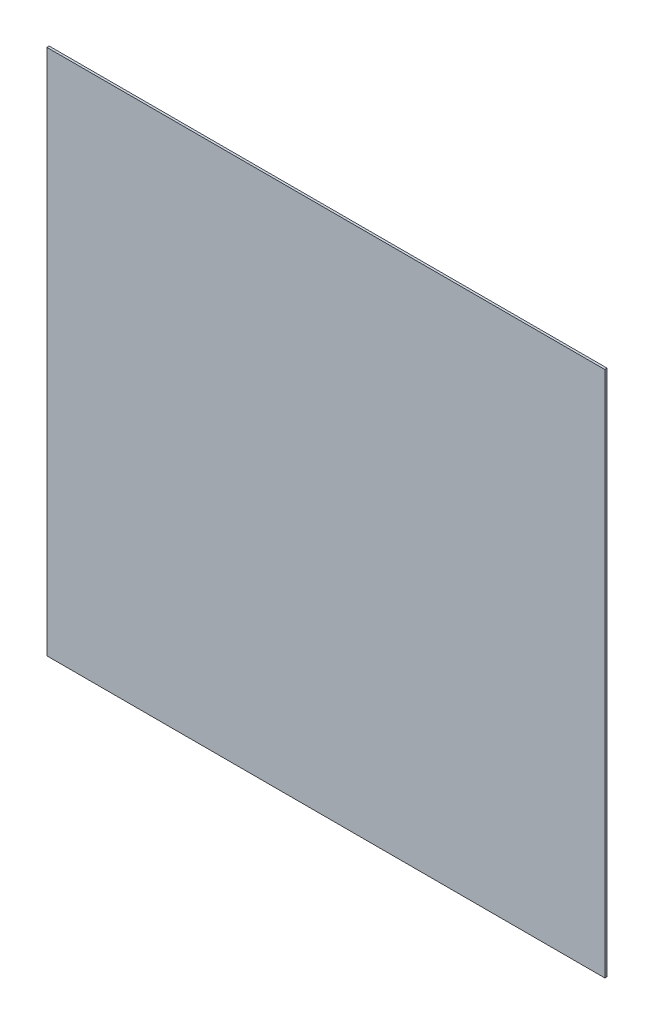
ISO-10303-21;
HEADER;
FILE_DESCRIPTION(('STEP AP214'),'2;1');
FILE_NAME('part.step','',(''),(''),'','','');
FILE_SCHEMA(('AUTOMOTIVE_DESIGN { 1 0 10303 214 1 1 1 1 }'));
ENDSEC;
DATA;
#1=APPLICATION_CONTEXT('core data for automotive mechanical design processes');
#2=APPLICATION_PROTOCOL_DEFINITION('international standard','automotive_design',2000,#1);
#3=PRODUCT_CONTEXT('',#1,'mechanical');
#4=PRODUCT('Part','Part','',(#3));
#5=PRODUCT_RELATED_PRODUCT_CATEGORY('part','',(#4));
#6=PRODUCT_DEFINITION_FORMATION('','',#4);
#7=PRODUCT_DEFINITION_CONTEXT('part definition',#1,'design');
#8=PRODUCT_DEFINITION('design','',#6,#7);
#9=PRODUCT_DEFINITION_SHAPE('','',#8);
#10=(LENGTH_UNIT() NAMED_UNIT(*) SI_UNIT(.MILLI.,.METRE.));
#11=(NAMED_UNIT(*) PLANE_ANGLE_UNIT() SI_UNIT($,.RADIAN.));
#12=(NAMED_UNIT(*) SI_UNIT($,.STERADIAN.) SOLID_ANGLE_UNIT());
#13=UNCERTAINTY_MEASURE_WITH_UNIT(LENGTH_MEASURE(1.E-05),#10,'distance_accuracy_value','');
#14=(GEOMETRIC_REPRESENTATION_CONTEXT(3) GLOBAL_UNCERTAINTY_ASSIGNED_CONTEXT((#13)) GLOBAL_UNIT_ASSIGNED_CONTEXT((#10,
#11,#12)) REPRESENTATION_CONTEXT('',''));
#15=CARTESIAN_POINT('',(0.,0.,0.));
#16=DIRECTION('',(0.,0.,1.));
#17=DIRECTION('',(1.,0.,0.));
#18=AXIS2_PLACEMENT_3D('',#15,#16,#17);
#19=CARTESIAN_POINT('',(0.,0.,0.75));
#20=DIRECTION('',(1.,0.,0.));
#21=DIRECTION('',(0.,0.,-1.));
#22=AXIS2_PLACEMENT_3D('',#19,#20,#21);
#23=PLANE('',#22);
#24=DIRECTION('',(0.,-1.,0.));
#25=VECTOR('',#24,1.);
#26=CARTESIAN_POINT('',(0.,0.,0.));
#27=LINE('',#26,#25);
#28=CARTESIAN_POINT('',(0.,170.,0.));
#29=VERTEX_POINT('',#28);
#30=CARTESIAN_POINT('',(0.,0.,0.));
#31=VERTEX_POINT('',#30);
#32=EDGE_CURVE('E98',#29,#31,#27,.T.);
#33=ORIENTED_EDGE('',*,*,#32,.T.);
#34=DIRECTION('',(0.,0.,-1.));
#35=VECTOR('',#34,1.);
#36=CARTESIAN_POINT('',(0.,0.,0.75));
#37=LINE('',#36,#35);
#38=CARTESIAN_POINT('',(0.,0.,0.75));
#39=VERTEX_POINT('',#38);
#40=EDGE_CURVE('E11',#39,#31,#37,.T.);
#41=ORIENTED_EDGE('',*,*,#40,.F.);
#42=DIRECTION('',(0.,-1.,0.));
#43=VECTOR('',#42,1.);
#44=CARTESIAN_POINT('',(0.,0.,0.75));
#45=LINE('',#44,#43);
#46=CARTESIAN_POINT('',(0.,170.,0.75));
#47=VERTEX_POINT('',#46);
#48=EDGE_CURVE('E86',#47,#39,#45,.T.);
#49=ORIENTED_EDGE('',*,*,#48,.F.);
#50=DIRECTION('',(0.,0.,-1.));
#51=VECTOR('',#50,1.);
#52=CARTESIAN_POINT('',(0.,170.,0.75));
#53=LINE('',#52,#51);
#54=EDGE_CURVE('E94',#47,#29,#53,.T.);
#55=ORIENTED_EDGE('',*,*,#54,.T.);
#56=EDGE_LOOP('',(#33,#41,#49,#55));
#57=FACE_BOUND('',#56,.T.);
#58=ADVANCED_FACE('F35',(#57),#23,.F.);
#59=CARTESIAN_POINT('',(0.,0.,0.75));
#60=DIRECTION('',(0.,1.,0.));
#61=DIRECTION('',(0.,0.,1.));
#62=AXIS2_PLACEMENT_3D('',#59,#60,#61);
#63=PLANE('',#62);
#64=DIRECTION('',(1.,0.,0.));
#65=VECTOR('',#64,1.);
#66=CARTESIAN_POINT('',(0.,0.,0.));
#67=LINE('',#66,#65);
#68=CARTESIAN_POINT('',(180.,0.,0.));
#69=VERTEX_POINT('',#68);
#70=EDGE_CURVE('E90',#31,#69,#67,.T.);
#71=ORIENTED_EDGE('',*,*,#70,.T.);
#72=DIRECTION('',(0.,0.,-1.));
#73=VECTOR('',#72,1.);
#74=CARTESIAN_POINT('',(180.,0.,0.75));
#75=LINE('',#74,#73);
#76=CARTESIAN_POINT('',(180.,0.,0.75));
#77=VERTEX_POINT('',#76);
#78=EDGE_CURVE('E43',#77,#69,#75,.T.);
#79=ORIENTED_EDGE('',*,*,#78,.F.);
#80=DIRECTION('',(1.,0.,0.));
#81=VECTOR('',#80,1.);
#82=CARTESIAN_POINT('',(0.,0.,0.75));
#83=LINE('',#82,#81);
#84=EDGE_CURVE('E81',#39,#77,#83,.T.);
#85=ORIENTED_EDGE('',*,*,#84,.F.);
#86=ORIENTED_EDGE('',*,*,#40,.T.);
#87=EDGE_LOOP('',(#71,#79,#85,#86));
#88=FACE_BOUND('',#87,.T.);
#89=ADVANCED_FACE('F89',(#88),#63,.F.);
#90=CARTESIAN_POINT('',(180.,0.,0.75));
#91=DIRECTION('',(-1.,0.,0.));
#92=DIRECTION('',(0.,0.,1.));
#93=AXIS2_PLACEMENT_3D('',#90,#91,#92);
#94=PLANE('',#93);
#95=DIRECTION('',(0.,1.,0.));
#96=VECTOR('',#95,1.);
#97=CARTESIAN_POINT('',(180.,0.,0.));
#98=LINE('',#97,#96);
#99=CARTESIAN_POINT('',(180.,170.,0.));
#100=VERTEX_POINT('',#99);
#101=EDGE_CURVE('E68',#69,#100,#98,.T.);
#102=ORIENTED_EDGE('',*,*,#101,.T.);
#103=DIRECTION('',(0.,0.,-1.));
#104=VECTOR('',#103,1.);
#105=CARTESIAN_POINT('',(180.,170.,0.75));
#106=LINE('',#105,#104);
#107=CARTESIAN_POINT('',(180.,170.,0.75));
#108=VERTEX_POINT('',#107);
#109=EDGE_CURVE('E91',#108,#100,#106,.T.);
#110=ORIENTED_EDGE('',*,*,#109,.F.);
#111=DIRECTION('',(0.,1.,0.));
#112=VECTOR('',#111,1.);
#113=CARTESIAN_POINT('',(180.,0.,0.75));
#114=LINE('',#113,#112);
#115=EDGE_CURVE('E84',#77,#108,#114,.T.);
#116=ORIENTED_EDGE('',*,*,#115,.F.);
#117=ORIENTED_EDGE('',*,*,#78,.T.);
#118=EDGE_LOOP('',(#102,#110,#116,#117));
#119=FACE_BOUND('',#118,.T.);
#120=ADVANCED_FACE('F92',(#119),#94,.F.);
#121=CARTESIAN_POINT('',(0.,170.,0.75));
#122=DIRECTION('',(0.,-1.,0.));
#123=DIRECTION('',(0.,0.,-1.));
#124=AXIS2_PLACEMENT_3D('',#121,#122,#123);
#125=PLANE('',#124);
#126=DIRECTION('',(-1.,0.,0.));
#127=VECTOR('',#126,1.);
#128=CARTESIAN_POINT('',(0.,170.,0.));
#129=LINE('',#128,#127);
#130=EDGE_CURVE('E74',#100,#29,#129,.T.);
#131=ORIENTED_EDGE('',*,*,#130,.T.);
#132=ORIENTED_EDGE('',*,*,#54,.F.);
#133=DIRECTION('',(-1.,0.,0.));
#134=VECTOR('',#133,1.);
#135=CARTESIAN_POINT('',(0.,170.,0.75));
#136=LINE('',#135,#134);
#137=EDGE_CURVE('E51',#108,#47,#136,.T.);
#138=ORIENTED_EDGE('',*,*,#137,.F.);
#139=ORIENTED_EDGE('',*,*,#109,.T.);
#140=EDGE_LOOP('',(#131,#132,#138,#139));
#141=FACE_BOUND('',#140,.T.);
#142=ADVANCED_FACE('F105',(#141),#125,.F.);
#143=CARTESIAN_POINT('',(0.,0.,0.75));
#144=DIRECTION('',(0.,0.,-1.));
#145=DIRECTION('',(-1.,0.,0.));
#146=AXIS2_PLACEMENT_3D('',#143,#144,#145);
#147=PLANE('',#146);
#148=ORIENTED_EDGE('',*,*,#48,.T.);
#149=ORIENTED_EDGE('',*,*,#84,.T.);
#150=ORIENTED_EDGE('',*,*,#115,.T.);
#151=ORIENTED_EDGE('',*,*,#137,.T.);
#152=EDGE_LOOP('',(#148,#149,#150,#151));
#153=FACE_BOUND('',#152,.T.);
#154=ADVANCED_FACE('F82',(#153),#147,.F.);
#155=CARTESIAN_POINT('',(0.,0.,0.));
#156=DIRECTION('',(0.,0.,-1.));
#157=DIRECTION('',(-1.,0.,0.));
#158=AXIS2_PLACEMENT_3D('',#155,#156,#157);
#159=PLANE('',#158);
#160=ORIENTED_EDGE('',*,*,#32,.F.);
#161=ORIENTED_EDGE('',*,*,#130,.F.);
#162=ORIENTED_EDGE('',*,*,#101,.F.);
#163=ORIENTED_EDGE('',*,*,#70,.F.);
#164=EDGE_LOOP('',(#160,#161,#162,#163));
#165=FACE_BOUND('',#164,.T.);
#166=ADVANCED_FACE('F108',(#165),#159,.T.);
#167=CLOSED_SHELL('',(#58,#89,#120,#142,#154,#166));
#168=MANIFOLD_SOLID_BREP('B2',#167);
#169=ADVANCED_BREP_SHAPE_REPRESENTATION('',(#18,#168),#14);
#170=SHAPE_DEFINITION_REPRESENTATION(#9,#169);
ENDSEC;
END-ISO-10303-21;
